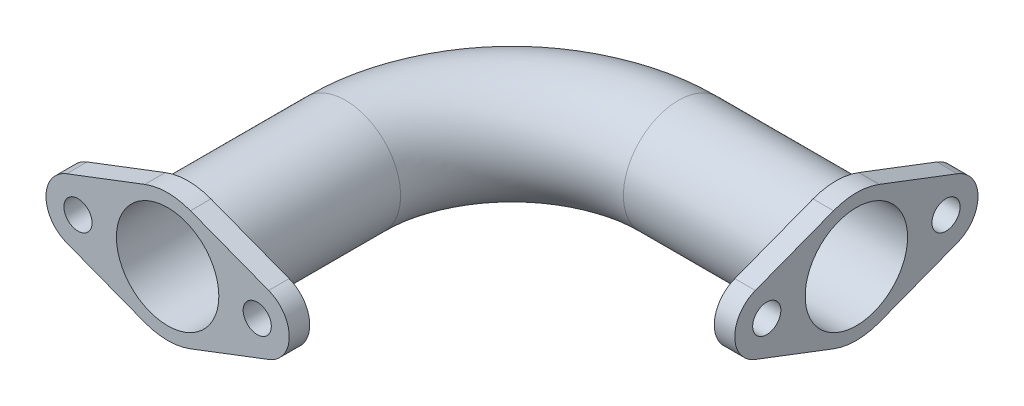
ISO-10303-21;
HEADER;
FILE_DESCRIPTION(('STEP AP214'),'2;1');
FILE_NAME('part.step','',(''),(''),'','','');
FILE_SCHEMA(('AUTOMOTIVE_DESIGN { 1 0 10303 214 1 1 1 1 }'));
ENDSEC;
DATA;
#1=APPLICATION_CONTEXT('core data for automotive mechanical design processes');
#2=APPLICATION_PROTOCOL_DEFINITION('international standard','automotive_design',2000,#1);
#3=PRODUCT_CONTEXT('',#1,'mechanical');
#4=PRODUCT('Part','Part','',(#3));
#5=PRODUCT_RELATED_PRODUCT_CATEGORY('part','',(#4));
#6=PRODUCT_DEFINITION_FORMATION('','',#4);
#7=PRODUCT_DEFINITION_CONTEXT('part definition',#1,'design');
#8=PRODUCT_DEFINITION('design','',#6,#7);
#9=PRODUCT_DEFINITION_SHAPE('','',#8);
#10=(LENGTH_UNIT() NAMED_UNIT(*) SI_UNIT(.MILLI.,.METRE.));
#11=(NAMED_UNIT(*) PLANE_ANGLE_UNIT() SI_UNIT($,.RADIAN.));
#12=(NAMED_UNIT(*) SI_UNIT($,.STERADIAN.) SOLID_ANGLE_UNIT());
#13=UNCERTAINTY_MEASURE_WITH_UNIT(LENGTH_MEASURE(1.E-05),#10,'distance_accuracy_value','');
#14=(GEOMETRIC_REPRESENTATION_CONTEXT(3) GLOBAL_UNCERTAINTY_ASSIGNED_CONTEXT((#13)) GLOBAL_UNIT_ASSIGNED_CONTEXT((#10,
#11,#12)) REPRESENTATION_CONTEXT('',''));
#15=CARTESIAN_POINT('',(0.,0.,0.));
#16=DIRECTION('',(0.,0.,1.));
#17=DIRECTION('',(1.,0.,0.));
#18=AXIS2_PLACEMENT_3D('',#15,#16,#17);
#19=CARTESIAN_POINT('',(-21.5,0.,0.));
#20=DIRECTION('',(0.,0.,-1.));
#21=DIRECTION('',(-1.,0.,0.));
#22=AXIS2_PLACEMENT_3D('',#19,#20,#21);
#23=CYLINDRICAL_SURFACE('',#22,21.5);
#24=CARTESIAN_POINT('',(-21.5,0.,-61.5));
#25=DIRECTION('',(0.,0.,-1.));
#26=DIRECTION('',(-1.,0.,0.));
#27=AXIS2_PLACEMENT_3D('',#24,#25,#26);
#28=CIRCLE('',#27,21.5);
#29=CARTESIAN_POINT('',(-43.,0.,-61.5));
#30=VERTEX_POINT('',#29);
#31=EDGE_CURVE('E212',#30,#30,#28,.T.);
#32=ORIENTED_EDGE('',*,*,#31,.F.);
#33=EDGE_LOOP('',(#32));
#34=FACE_BOUND('',#33,.T.);
#35=CARTESIAN_POINT('',(-21.5,0.,0.));
#36=DIRECTION('',(0.,0.,-1.));
#37=DIRECTION('',(-1.,0.,0.));
#38=AXIS2_PLACEMENT_3D('',#35,#36,#37);
#39=CIRCLE('',#38,21.5);
#40=CARTESIAN_POINT('',(-43.,0.,0.));
#41=VERTEX_POINT('',#40);
#42=EDGE_CURVE('E172',#41,#41,#39,.T.);
#43=ORIENTED_EDGE('',*,*,#42,.T.);
#44=EDGE_LOOP('',(#43));
#45=FACE_BOUND('',#44,.T.);
#46=ADVANCED_FACE('F61',(#34,#45),#23,.T.);
#47=CARTESIAN_POINT('',(43.5,0.,-61.5));
#48=DIRECTION('',(0.,-1.,0.));
#49=DIRECTION('',(0.,0.,-1.));
#50=AXIS2_PLACEMENT_3D('',#47,#48,#49);
#51=TOROIDAL_SURFACE('',#50,65.,21.5);
#52=CARTESIAN_POINT('',(43.5,0.,-126.5));
#53=DIRECTION('',(1.,0.,0.));
#54=DIRECTION('',(0.,0.,-1.));
#55=AXIS2_PLACEMENT_3D('',#52,#53,#54);
#56=CIRCLE('',#55,21.5);
#57=CARTESIAN_POINT('',(43.5,0.,-148.));
#58=VERTEX_POINT('',#57);
#59=EDGE_CURVE('E70',#58,#58,#56,.T.);
#60=CARTESIAN_POINT('',(43.5,0.,-61.5));
#61=DIRECTION('',(0.,-1.,0.));
#62=DIRECTION('',(0.,0.,-1.));
#63=AXIS2_PLACEMENT_3D('',#60,#61,#62);
#64=CIRCLE('',#63,86.5);
#65=EDGE_CURVE('',#30,#58,#64,.T.);
#66=ORIENTED_EDGE('',*,*,#31,.T.);
#67=ORIENTED_EDGE('',*,*,#59,.F.);
#68=ORIENTED_EDGE('',*,*,#65,.T.);
#69=ORIENTED_EDGE('',*,*,#65,.F.);
#70=EDGE_LOOP('',(#66,#68,#67,#69));
#71=FACE_BOUND('',#70,.T.);
#72=ADVANCED_FACE('F221',(#71),#51,.T.);
#73=CARTESIAN_POINT('',(43.5,0.,-126.5));
#74=DIRECTION('',(1.,0.,0.));
#75=DIRECTION('',(0.,0.,-1.));
#76=AXIS2_PLACEMENT_3D('',#73,#74,#75);
#77=CYLINDRICAL_SURFACE('',#76,21.5);
#78=CARTESIAN_POINT('',(105.,0.,-126.5));
#79=DIRECTION('',(1.,0.,0.));
#80=DIRECTION('',(0.,0.,-1.));
#81=AXIS2_PLACEMENT_3D('',#78,#79,#80);
#82=CIRCLE('',#81,21.5);
#83=CARTESIAN_POINT('',(105.,0.,-148.));
#84=VERTEX_POINT('',#83);
#85=EDGE_CURVE('E12',#84,#84,#82,.T.);
#86=ORIENTED_EDGE('',*,*,#85,.F.);
#87=EDGE_LOOP('',(#86));
#88=FACE_BOUND('',#87,.T.);
#89=ORIENTED_EDGE('',*,*,#59,.T.);
#90=EDGE_LOOP('',(#89));
#91=FACE_BOUND('',#90,.T.);
#92=ADVANCED_FACE('F63',(#88,#91),#77,.T.);
#93=CARTESIAN_POINT('',(43.5,0.,-126.5));
#94=DIRECTION('',(1.,0.,0.));
#95=DIRECTION('',(0.,0.,-1.));
#96=AXIS2_PLACEMENT_3D('',#93,#94,#95);
#97=CYLINDRICAL_SURFACE('',#96,20.);
#98=CARTESIAN_POINT('',(43.5,0.,-126.5));
#99=DIRECTION('',(1.,0.,0.));
#100=DIRECTION('',(0.,0.,-1.));
#101=AXIS2_PLACEMENT_3D('',#98,#99,#100);
#102=CIRCLE('',#101,20.);
#103=CARTESIAN_POINT('',(43.5,0.,-146.5));
#104=VERTEX_POINT('',#103);
#105=EDGE_CURVE('E206',#104,#104,#102,.T.);
#106=ORIENTED_EDGE('',*,*,#105,.F.);
#107=EDGE_LOOP('',(#106));
#108=FACE_BOUND('',#107,.T.);
#109=CARTESIAN_POINT('',(113.,0.,-126.5));
#110=DIRECTION('',(1.,0.,0.));
#111=DIRECTION('',(0.,0.,-1.));
#112=AXIS2_PLACEMENT_3D('',#109,#110,#111);
#113=CIRCLE('',#112,20.);
#114=CARTESIAN_POINT('',(113.,0.,-146.5));
#115=VERTEX_POINT('',#114);
#116=EDGE_CURVE('E162',#115,#115,#113,.F.);
#117=ORIENTED_EDGE('',*,*,#116,.F.);
#118=EDGE_LOOP('',(#117));
#119=FACE_BOUND('',#118,.T.);
#120=ADVANCED_FACE('F229',(#108,#119),#97,.F.);
#121=CARTESIAN_POINT('',(-21.5,0.,4.));
#122=DIRECTION('',(0.,0.,-1.));
#123=DIRECTION('',(-1.,0.,0.));
#124=AXIS2_PLACEMENT_3D('',#121,#122,#123);
#125=CYLINDRICAL_SURFACE('',#124,20.);
#126=CARTESIAN_POINT('',(-21.5,0.,-61.5));
#127=DIRECTION('',(0.,0.,-1.));
#128=DIRECTION('',(-1.,0.,0.));
#129=AXIS2_PLACEMENT_3D('',#126,#127,#128);
#130=CIRCLE('',#129,20.);
#131=CARTESIAN_POINT('',(-41.5,0.,-61.5));
#132=VERTEX_POINT('',#131);
#133=EDGE_CURVE('E209',#132,#132,#130,.T.);
#134=ORIENTED_EDGE('',*,*,#133,.T.);
#135=EDGE_LOOP('',(#134));
#136=FACE_BOUND('',#135,.T.);
#137=CARTESIAN_POINT('',(-21.5,0.,8.));
#138=DIRECTION('',(0.,0.,1.));
#139=DIRECTION('',(1.,0.,0.));
#140=AXIS2_PLACEMENT_3D('',#137,#138,#139);
#141=CIRCLE('',#140,20.);
#142=CARTESIAN_POINT('',(-1.5,0.,8.));
#143=VERTEX_POINT('',#142);
#144=EDGE_CURVE('E285',#143,#143,#141,.F.);
#145=ORIENTED_EDGE('',*,*,#144,.F.);
#146=EDGE_LOOP('',(#145));
#147=FACE_BOUND('',#146,.T.);
#148=ADVANCED_FACE('F344',(#136,#147),#125,.F.);
#149=CARTESIAN_POINT('',(43.5,0.,-61.5));
#150=DIRECTION('',(0.,-1.,0.));
#151=DIRECTION('',(0.,0.,-1.));
#152=AXIS2_PLACEMENT_3D('',#149,#150,#151);
#153=TOROIDAL_SURFACE('',#152,65.,20.);
#154=CARTESIAN_POINT('',(43.5,0.,-61.5));
#155=DIRECTION('',(0.,-1.,0.));
#156=DIRECTION('',(0.,0.,-1.));
#157=AXIS2_PLACEMENT_3D('',#154,#155,#156);
#158=CIRCLE('',#157,85.);
#159=EDGE_CURVE('',#132,#104,#158,.T.);
#160=ORIENTED_EDGE('',*,*,#133,.F.);
#161=ORIENTED_EDGE('',*,*,#105,.T.);
#162=ORIENTED_EDGE('',*,*,#159,.T.);
#163=ORIENTED_EDGE('',*,*,#159,.F.);
#164=EDGE_LOOP('',(#160,#162,#161,#163));
#165=FACE_BOUND('',#164,.T.);
#166=ADVANCED_FACE('F347',(#165),#153,.F.);
#167=CARTESIAN_POINT('',(113.,65.5502787555411,-25.0637755102034));
#168=DIRECTION('',(0.,-0.934049773615861,0.357142857142851));
#169=DIRECTION('',(0.,-0.357142857142851,-0.934049773615861));
#170=AXIS2_PLACEMENT_3D('',#167,#168,#169);
#171=PLANE('',#170);
#172=DIRECTION('',(0.,0.357142857142851,0.934049773615861));
#173=VECTOR('',#172,1.);
#174=CARTESIAN_POINT('',(105.,65.5502787555411,-25.0637755102034));
#175=LINE('',#174,#173);
#176=CARTESIAN_POINT('',(105.,11.6756221701985,-165.964285714286));
#177=VERTEX_POINT('',#176);
#178=CARTESIAN_POINT('',(105.,23.3512443403966,-135.428571428572));
#179=VERTEX_POINT('',#178);
#180=EDGE_CURVE('E175',#177,#179,#175,.T.);
#181=ORIENTED_EDGE('',*,*,#180,.T.);
#182=DIRECTION('',(-1.,0.,0.));
#183=VECTOR('',#182,1.);
#184=CARTESIAN_POINT('',(113.,23.3512443403966,-135.428571428572));
#185=LINE('',#184,#183);
#186=CARTESIAN_POINT('',(113.,23.3512443403966,-135.428571428572));
#187=VERTEX_POINT('',#186);
#188=EDGE_CURVE('E204',#187,#179,#185,.T.);
#189=ORIENTED_EDGE('',*,*,#188,.F.);
#190=DIRECTION('',(0.,0.357142857142851,0.934049773615861));
#191=VECTOR('',#190,1.);
#192=CARTESIAN_POINT('',(113.,65.5502787555411,-25.0637755102034));
#193=LINE('',#192,#191);
#194=CARTESIAN_POINT('',(113.,11.6756221701985,-165.964285714286));
#195=VERTEX_POINT('',#194);
#196=EDGE_CURVE('E308',#195,#187,#193,.T.);
#197=ORIENTED_EDGE('',*,*,#196,.F.);
#198=DIRECTION('',(-1.,0.,0.));
#199=VECTOR('',#198,1.);
#200=CARTESIAN_POINT('',(113.,11.6756221701985,-165.964285714286));
#201=LINE('',#200,#199);
#202=EDGE_CURVE('E78',#195,#177,#201,.T.);
#203=ORIENTED_EDGE('',*,*,#202,.T.);
#204=EDGE_LOOP('',(#181,#189,#197,#203));
#205=FACE_BOUND('',#204,.T.);
#206=ADVANCED_FACE('F371',(#205),#171,.F.);
#207=CARTESIAN_POINT('',(113.,0.,-126.5));
#208=DIRECTION('',(-1.,0.,0.));
#209=DIRECTION('',(0.,0.,1.));
#210=AXIS2_PLACEMENT_3D('',#207,#208,#209);
#211=CYLINDRICAL_SURFACE('',#210,25.0000000000001);
#212=CARTESIAN_POINT('',(105.,0.,-126.5));
#213=DIRECTION('',(1.,0.,0.));
#214=DIRECTION('',(0.,0.,-1.));
#215=AXIS2_PLACEMENT_3D('',#212,#213,#214);
#216=CIRCLE('',#215,25.0000000000001);
#217=CARTESIAN_POINT('',(105.,23.3512443403965,-117.571428571429));
#218=VERTEX_POINT('',#217);
#219=EDGE_CURVE('E177',#179,#218,#216,.T.);
#220=ORIENTED_EDGE('',*,*,#219,.T.);
#221=DIRECTION('',(-1.,0.,0.));
#222=VECTOR('',#221,1.);
#223=CARTESIAN_POINT('',(113.,23.3512443403965,-117.571428571429));
#224=LINE('',#223,#222);
#225=CARTESIAN_POINT('',(113.,23.3512443403965,-117.571428571429));
#226=VERTEX_POINT('',#225);
#227=EDGE_CURVE('E202',#226,#218,#224,.T.);
#228=ORIENTED_EDGE('',*,*,#227,.F.);
#229=CARTESIAN_POINT('',(113.,0.,-126.5));
#230=DIRECTION('',(1.,0.,0.));
#231=DIRECTION('',(0.,0.,-1.));
#232=AXIS2_PLACEMENT_3D('',#229,#230,#231);
#233=CIRCLE('',#232,25.0000000000001);
#234=EDGE_CURVE('E118',#187,#226,#233,.T.);
#235=ORIENTED_EDGE('',*,*,#234,.F.);
#236=ORIENTED_EDGE('',*,*,#188,.T.);
#237=EDGE_LOOP('',(#220,#228,#235,#236));
#238=FACE_BOUND('',#237,.T.);
#239=ADVANCED_FACE('F379',(#238),#211,.T.);
#240=CARTESIAN_POINT('',(113.,-18.8477900747486,-7.20663265306122));
#241=DIRECTION('',(0.,0.934049773615859,0.357142857142857));
#242=DIRECTION('',(0.,-0.357142857142857,0.934049773615859));
#243=AXIS2_PLACEMENT_3D('',#240,#241,#242);
#244=PLANE('',#243);
#245=DIRECTION('',(0.,0.357142857142857,-0.934049773615859));
#246=VECTOR('',#245,1.);
#247=CARTESIAN_POINT('',(105.,-18.8477900747486,-7.20663265306122));
#248=LINE('',#247,#246);
#249=CARTESIAN_POINT('',(105.,11.6756221701982,-87.0357142857143));
#250=VERTEX_POINT('',#249);
#251=EDGE_CURVE('E180',#250,#218,#248,.T.);
#252=ORIENTED_EDGE('',*,*,#251,.F.);
#253=DIRECTION('',(-1.,0.,0.));
#254=VECTOR('',#253,1.);
#255=CARTESIAN_POINT('',(113.,11.6756221701982,-87.0357142857143));
#256=LINE('',#255,#254);
#257=CARTESIAN_POINT('',(113.,11.6756221701982,-87.0357142857143));
#258=VERTEX_POINT('',#257);
#259=EDGE_CURVE('E200',#258,#250,#256,.T.);
#260=ORIENTED_EDGE('',*,*,#259,.F.);
#261=DIRECTION('',(0.,0.357142857142857,-0.934049773615859));
#262=VECTOR('',#261,1.);
#263=CARTESIAN_POINT('',(113.,-18.8477900747486,-7.20663265306122));
#264=LINE('',#263,#262);
#265=EDGE_CURVE('E311',#258,#226,#264,.T.);
#266=ORIENTED_EDGE('',*,*,#265,.T.);
#267=ORIENTED_EDGE('',*,*,#227,.T.);
#268=EDGE_LOOP('',(#252,#260,#266,#267));
#269=FACE_BOUND('',#268,.T.);
#270=ADVANCED_FACE('F383',(#269),#244,.T.);
#271=CARTESIAN_POINT('',(113.,0.,-91.5));
#272=DIRECTION('',(-1.,0.,0.));
#273=DIRECTION('',(0.,0.,1.));
#274=AXIS2_PLACEMENT_3D('',#271,#272,#273);
#275=CYLINDRICAL_SURFACE('',#274,12.5);
#276=CARTESIAN_POINT('',(105.,0.,-91.5));
#277=DIRECTION('',(1.,0.,0.));
#278=DIRECTION('',(0.,0.,-1.));
#279=AXIS2_PLACEMENT_3D('',#276,#277,#278);
#280=CIRCLE('',#279,12.5);
#281=CARTESIAN_POINT('',(105.,-11.6756221701982,-87.0357142857143));
#282=VERTEX_POINT('',#281);
#283=EDGE_CURVE('E183',#250,#282,#280,.T.);
#284=ORIENTED_EDGE('',*,*,#283,.T.);
#285=DIRECTION('',(-1.,0.,0.));
#286=VECTOR('',#285,1.);
#287=CARTESIAN_POINT('',(113.,-11.6756221701982,-87.0357142857143));
#288=LINE('',#287,#286);
#289=CARTESIAN_POINT('',(113.,-11.6756221701982,-87.0357142857143));
#290=VERTEX_POINT('',#289);
#291=EDGE_CURVE('E197',#290,#282,#288,.T.);
#292=ORIENTED_EDGE('',*,*,#291,.F.);
#293=CARTESIAN_POINT('',(113.,0.,-91.5));
#294=DIRECTION('',(1.,0.,0.));
#295=DIRECTION('',(0.,0.,-1.));
#296=AXIS2_PLACEMENT_3D('',#293,#294,#295);
#297=CIRCLE('',#296,12.5);
#298=EDGE_CURVE('E314',#258,#290,#297,.T.);
#299=ORIENTED_EDGE('',*,*,#298,.F.);
#300=ORIENTED_EDGE('',*,*,#259,.T.);
#301=EDGE_LOOP('',(#284,#292,#299,#300));
#302=FACE_BOUND('',#301,.T.);
#303=ADVANCED_FACE('F319',(#302),#275,.T.);
#304=CARTESIAN_POINT('',(113.,18.8477900747486,-7.20663265306123));
#305=DIRECTION('',(0.,0.934049773615859,-0.357142857142857));
#306=DIRECTION('',(0.,0.357142857142857,0.934049773615859));
#307=AXIS2_PLACEMENT_3D('',#304,#305,#306);
#308=PLANE('',#307);
#309=DIRECTION('',(0.,-0.357142857142857,-0.934049773615859));
#310=VECTOR('',#309,1.);
#311=CARTESIAN_POINT('',(105.,18.8477900747486,-7.20663265306123));
#312=LINE('',#311,#310);
#313=CARTESIAN_POINT('',(105.,-23.3512443403965,-117.571428571429));
#314=VERTEX_POINT('',#313);
#315=EDGE_CURVE('E185',#282,#314,#312,.T.);
#316=ORIENTED_EDGE('',*,*,#315,.T.);
#317=DIRECTION('',(-1.,0.,0.));
#318=VECTOR('',#317,1.);
#319=CARTESIAN_POINT('',(113.,-23.3512443403965,-117.571428571429));
#320=LINE('',#319,#318);
#321=CARTESIAN_POINT('',(113.,-23.3512443403965,-117.571428571429));
#322=VERTEX_POINT('',#321);
#323=EDGE_CURVE('E157',#322,#314,#320,.T.);
#324=ORIENTED_EDGE('',*,*,#323,.F.);
#325=DIRECTION('',(0.,-0.357142857142857,-0.934049773615859));
#326=VECTOR('',#325,1.);
#327=CARTESIAN_POINT('',(113.,18.8477900747486,-7.20663265306123));
#328=LINE('',#327,#326);
#329=EDGE_CURVE('E145',#290,#322,#328,.T.);
#330=ORIENTED_EDGE('',*,*,#329,.F.);
#331=ORIENTED_EDGE('',*,*,#291,.T.);
#332=EDGE_LOOP('',(#316,#324,#330,#331));
#333=FACE_BOUND('',#332,.T.);
#334=ADVANCED_FACE('F323',(#333),#308,.F.);
#335=CARTESIAN_POINT('',(113.,0.,-126.5));
#336=DIRECTION('',(-1.,0.,0.));
#337=DIRECTION('',(0.,0.,1.));
#338=AXIS2_PLACEMENT_3D('',#335,#336,#337);
#339=CYLINDRICAL_SURFACE('',#338,25.0000000000001);
#340=CARTESIAN_POINT('',(105.,0.,-126.5));
#341=DIRECTION('',(1.,0.,0.));
#342=DIRECTION('',(0.,0.,-1.));
#343=AXIS2_PLACEMENT_3D('',#340,#341,#342);
#344=CIRCLE('',#343,25.0000000000001);
#345=CARTESIAN_POINT('',(105.,-23.3512443403964,-135.428571428572));
#346=VERTEX_POINT('',#345);
#347=EDGE_CURVE('E154',#314,#346,#344,.T.);
#348=ORIENTED_EDGE('',*,*,#347,.T.);
#349=DIRECTION('',(-1.,0.,0.));
#350=VECTOR('',#349,1.);
#351=CARTESIAN_POINT('',(113.,-23.3512443403964,-135.428571428572));
#352=LINE('',#351,#350);
#353=CARTESIAN_POINT('',(113.,-23.3512443403964,-135.428571428572));
#354=VERTEX_POINT('',#353);
#355=EDGE_CURVE('E151',#354,#346,#352,.T.);
#356=ORIENTED_EDGE('',*,*,#355,.F.);
#357=CARTESIAN_POINT('',(113.,0.,-126.5));
#358=DIRECTION('',(1.,0.,0.));
#359=DIRECTION('',(0.,0.,-1.));
#360=AXIS2_PLACEMENT_3D('',#357,#358,#359);
#361=CIRCLE('',#360,25.0000000000001);
#362=EDGE_CURVE('E137',#322,#354,#361,.T.);
#363=ORIENTED_EDGE('',*,*,#362,.F.);
#364=ORIENTED_EDGE('',*,*,#323,.T.);
#365=EDGE_LOOP('',(#348,#356,#363,#364));
#366=FACE_BOUND('',#365,.T.);
#367=ADVANCED_FACE('F152',(#366),#339,.T.);
#368=CARTESIAN_POINT('',(113.,-65.5502787555422,-25.0637755102049));
#369=DIRECTION('',(0.,-0.934049773615856,-0.357142857142863));
#370=DIRECTION('',(0.,0.357142857142863,-0.934049773615856));
#371=AXIS2_PLACEMENT_3D('',#368,#369,#370);
#372=PLANE('',#371);
#373=DIRECTION('',(0.,-0.357142857142863,0.934049773615856));
#374=VECTOR('',#373,1.);
#375=CARTESIAN_POINT('',(105.,-65.5502787555422,-25.0637755102049));
#376=LINE('',#375,#374);
#377=CARTESIAN_POINT('',(105.,-11.6756221701979,-165.964285714286));
#378=VERTEX_POINT('',#377);
#379=EDGE_CURVE('E188',#378,#346,#376,.T.);
#380=ORIENTED_EDGE('',*,*,#379,.F.);
#381=DIRECTION('',(-1.,0.,0.));
#382=VECTOR('',#381,1.);
#383=CARTESIAN_POINT('',(113.,-11.6756221701979,-165.964285714286));
#384=LINE('',#383,#382);
#385=CARTESIAN_POINT('',(113.,-11.6756221701979,-165.964285714286));
#386=VERTEX_POINT('',#385);
#387=EDGE_CURVE('E105',#386,#378,#384,.T.);
#388=ORIENTED_EDGE('',*,*,#387,.F.);
#389=DIRECTION('',(0.,-0.357142857142863,0.934049773615856));
#390=VECTOR('',#389,1.);
#391=CARTESIAN_POINT('',(113.,-65.5502787555422,-25.0637755102049));
#392=LINE('',#391,#390);
#393=EDGE_CURVE('E143',#386,#354,#392,.T.);
#394=ORIENTED_EDGE('',*,*,#393,.T.);
#395=ORIENTED_EDGE('',*,*,#355,.T.);
#396=EDGE_LOOP('',(#380,#388,#394,#395));
#397=FACE_BOUND('',#396,.T.);
#398=ADVANCED_FACE('F159',(#397),#372,.T.);
#399=CARTESIAN_POINT('',(113.,2.63677968348475E-13,-161.5));
#400=DIRECTION('',(-1.,0.,0.));
#401=DIRECTION('',(0.,0.,1.));
#402=AXIS2_PLACEMENT_3D('',#399,#400,#401);
#403=CYLINDRICAL_SURFACE('',#402,12.5);
#404=CARTESIAN_POINT('',(105.,2.63677968348475E-13,-161.5));
#405=DIRECTION('',(1.,0.,0.));
#406=DIRECTION('',(0.,0.,-1.));
#407=AXIS2_PLACEMENT_3D('',#404,#405,#406);
#408=CIRCLE('',#407,12.5);
#409=EDGE_CURVE('E190',#177,#378,#408,.F.);
#410=ORIENTED_EDGE('',*,*,#409,.F.);
#411=ORIENTED_EDGE('',*,*,#202,.F.);
#412=CARTESIAN_POINT('',(113.,2.63677968348475E-13,-161.5));
#413=DIRECTION('',(1.,0.,0.));
#414=DIRECTION('',(0.,0.,-1.));
#415=AXIS2_PLACEMENT_3D('',#412,#413,#414);
#416=CIRCLE('',#415,12.5);
#417=EDGE_CURVE('E160',#195,#386,#416,.F.);
#418=ORIENTED_EDGE('',*,*,#417,.T.);
#419=ORIENTED_EDGE('',*,*,#387,.T.);
#420=EDGE_LOOP('',(#410,#411,#418,#419));
#421=FACE_BOUND('',#420,.T.);
#422=ADVANCED_FACE('F326',(#421),#403,.T.);
#423=CARTESIAN_POINT('',(113.,0.,-91.5));
#424=DIRECTION('',(-1.,0.,0.));
#425=DIRECTION('',(0.,0.,1.));
#426=AXIS2_PLACEMENT_3D('',#423,#424,#425);
#427=CYLINDRICAL_SURFACE('',#426,5.5);
#428=CARTESIAN_POINT('',(113.,0.,-91.5));
#429=DIRECTION('',(1.,0.,0.));
#430=DIRECTION('',(0.,0.,-1.));
#431=AXIS2_PLACEMENT_3D('',#428,#429,#430);
#432=CIRCLE('',#431,5.5);
#433=CARTESIAN_POINT('',(113.,0.,-97.));
#434=VERTEX_POINT('',#433);
#435=EDGE_CURVE('E305',#434,#434,#432,.T.);
#436=ORIENTED_EDGE('',*,*,#435,.T.);
#437=EDGE_LOOP('',(#436));
#438=FACE_BOUND('',#437,.T.);
#439=CARTESIAN_POINT('',(105.,0.,-91.5));
#440=DIRECTION('',(1.,0.,0.));
#441=DIRECTION('',(0.,0.,-1.));
#442=AXIS2_PLACEMENT_3D('',#439,#440,#441);
#443=CIRCLE('',#442,5.5);
#444=CARTESIAN_POINT('',(105.,0.,-97.));
#445=VERTEX_POINT('',#444);
#446=EDGE_CURVE('E171',#445,#445,#443,.T.);
#447=ORIENTED_EDGE('',*,*,#446,.F.);
#448=EDGE_LOOP('',(#447));
#449=FACE_BOUND('',#448,.T.);
#450=ADVANCED_FACE('F328',(#438,#449),#427,.F.);
#451=CARTESIAN_POINT('',(113.,2.63677968348475E-13,-161.5));
#452=DIRECTION('',(-1.,0.,0.));
#453=DIRECTION('',(0.,0.,1.));
#454=AXIS2_PLACEMENT_3D('',#451,#452,#453);
#455=CYLINDRICAL_SURFACE('',#454,5.50000000000001);
#456=CARTESIAN_POINT('',(113.,2.63677968348475E-13,-161.5));
#457=DIRECTION('',(1.,0.,0.));
#458=DIRECTION('',(0.,0.,-1.));
#459=AXIS2_PLACEMENT_3D('',#456,#457,#458);
#460=CIRCLE('',#459,5.50000000000001);
#461=CARTESIAN_POINT('',(113.,2.63677968348475E-13,-167.));
#462=VERTEX_POINT('',#461);
#463=EDGE_CURVE('E193',#462,#462,#460,.F.);
#464=ORIENTED_EDGE('',*,*,#463,.F.);
#465=EDGE_LOOP('',(#464));
#466=FACE_BOUND('',#465,.T.);
#467=CARTESIAN_POINT('',(105.,2.63677968348475E-13,-161.5));
#468=DIRECTION('',(1.,0.,0.));
#469=DIRECTION('',(0.,0.,-1.));
#470=AXIS2_PLACEMENT_3D('',#467,#468,#469);
#471=CIRCLE('',#470,5.50000000000001);
#472=CARTESIAN_POINT('',(105.,2.63677968348475E-13,-167.));
#473=VERTEX_POINT('',#472);
#474=EDGE_CURVE('E168',#473,#473,#471,.F.);
#475=ORIENTED_EDGE('',*,*,#474,.T.);
#476=EDGE_LOOP('',(#475));
#477=FACE_BOUND('',#476,.T.);
#478=ADVANCED_FACE('F334',(#466,#477),#455,.F.);
#479=CARTESIAN_POINT('',(113.,0.,0.));
#480=DIRECTION('',(1.,0.,0.));
#481=DIRECTION('',(0.,0.,-1.));
#482=AXIS2_PLACEMENT_3D('',#479,#480,#481);
#483=PLANE('',#482);
#484=ORIENTED_EDGE('',*,*,#463,.T.);
#485=EDGE_LOOP('',(#484));
#486=FACE_BOUND('',#485,.T.);
#487=ORIENTED_EDGE('',*,*,#435,.F.);
#488=EDGE_LOOP('',(#487));
#489=FACE_BOUND('',#488,.T.);
#490=ORIENTED_EDGE('',*,*,#196,.T.);
#491=ORIENTED_EDGE('',*,*,#234,.T.);
#492=ORIENTED_EDGE('',*,*,#265,.F.);
#493=ORIENTED_EDGE('',*,*,#298,.T.);
#494=ORIENTED_EDGE('',*,*,#329,.T.);
#495=ORIENTED_EDGE('',*,*,#362,.T.);
#496=ORIENTED_EDGE('',*,*,#393,.F.);
#497=ORIENTED_EDGE('',*,*,#417,.F.);
#498=EDGE_LOOP('',(#490,#491,#492,#493,#494,#495,#496,#497));
#499=FACE_BOUND('',#498,.T.);
#500=ORIENTED_EDGE('',*,*,#116,.T.);
#501=EDGE_LOOP('',(#500));
#502=FACE_BOUND('',#501,.T.);
#503=ADVANCED_FACE('F139',(#486,#489,#499,#502),#483,.T.);
#504=CARTESIAN_POINT('',(105.,0.,0.));
#505=DIRECTION('',(1.,0.,0.));
#506=DIRECTION('',(0.,0.,-1.));
#507=AXIS2_PLACEMENT_3D('',#504,#505,#506);
#508=PLANE('',#507);
#509=ORIENTED_EDGE('',*,*,#85,.T.);
#510=EDGE_LOOP('',(#509));
#511=FACE_BOUND('',#510,.T.);
#512=ORIENTED_EDGE('',*,*,#474,.F.);
#513=EDGE_LOOP('',(#512));
#514=FACE_BOUND('',#513,.T.);
#515=ORIENTED_EDGE('',*,*,#446,.T.);
#516=EDGE_LOOP('',(#515));
#517=FACE_BOUND('',#516,.T.);
#518=ORIENTED_EDGE('',*,*,#180,.F.);
#519=ORIENTED_EDGE('',*,*,#409,.T.);
#520=ORIENTED_EDGE('',*,*,#379,.T.);
#521=ORIENTED_EDGE('',*,*,#347,.F.);
#522=ORIENTED_EDGE('',*,*,#315,.F.);
#523=ORIENTED_EDGE('',*,*,#283,.F.);
#524=ORIENTED_EDGE('',*,*,#251,.T.);
#525=ORIENTED_EDGE('',*,*,#219,.F.);
#526=EDGE_LOOP('',(#518,#519,#520,#521,#522,#523,#524,#525));
#527=FACE_BOUND('',#526,.T.);
#528=ADVANCED_FACE('F325',(#511,#514,#517,#527),#508,.F.);
#529=CARTESIAN_POINT('',(6.18622448979586,16.1790764358463,8.));
#530=DIRECTION('',(-0.357142857142851,-0.934049773615861,0.));
#531=DIRECTION('',(0.934049773615861,-0.357142857142851,0.));
#532=AXIS2_PLACEMENT_3D('',#529,#530,#531);
#533=PLANE('',#532);
#534=DIRECTION('',(-0.934049773615861,0.357142857142851,0.));
#535=VECTOR('',#534,1.);
#536=CARTESIAN_POINT('',(6.18622448979586,16.1790764358463,0.));
#537=LINE('',#536,#535);
#538=CARTESIAN_POINT('',(17.9642857142859,11.6756221701984,0.));
#539=VERTEX_POINT('',#538);
#540=CARTESIAN_POINT('',(-12.5714285714285,23.3512443403965,0.));
#541=VERTEX_POINT('',#540);
#542=EDGE_CURVE('E249',#539,#541,#537,.T.);
#543=ORIENTED_EDGE('',*,*,#542,.T.);
#544=DIRECTION('',(0.,0.,-1.));
#545=VECTOR('',#544,1.);
#546=CARTESIAN_POINT('',(-12.5714285714285,23.3512443403965,8.));
#547=LINE('',#546,#545);
#548=CARTESIAN_POINT('',(-12.5714285714285,23.3512443403965,8.));
#549=VERTEX_POINT('',#548);
#550=EDGE_CURVE('E215',#549,#541,#547,.T.);
#551=ORIENTED_EDGE('',*,*,#550,.F.);
#552=DIRECTION('',(-0.934049773615861,0.357142857142851,0.));
#553=VECTOR('',#552,1.);
#554=CARTESIAN_POINT('',(6.18622448979586,16.1790764358463,8.));
#555=LINE('',#554,#553);
#556=CARTESIAN_POINT('',(17.9642857142859,11.6756221701984,8.));
#557=VERTEX_POINT('',#556);
#558=EDGE_CURVE('E696',#557,#549,#555,.T.);
#559=ORIENTED_EDGE('',*,*,#558,.F.);
#560=DIRECTION('',(0.,0.,-1.));
#561=VECTOR('',#560,1.);
#562=CARTESIAN_POINT('',(17.9642857142859,11.6756221701984,8.));
#563=LINE('',#562,#561);
#564=EDGE_CURVE('E269',#557,#539,#563,.T.);
#565=ORIENTED_EDGE('',*,*,#564,.T.);
#566=EDGE_LOOP('',(#543,#551,#559,#565));
#567=FACE_BOUND('',#566,.T.);
#568=ADVANCED_FACE('F352',(#567),#533,.F.);
#569=CARTESIAN_POINT('',(-21.5000000000002,0.,8.));
#570=DIRECTION('',(0.,0.,-1.));
#571=DIRECTION('',(-1.,0.,0.));
#572=AXIS2_PLACEMENT_3D('',#569,#570,#571);
#573=CYLINDRICAL_SURFACE('',#572,25.0000000000001);
#574=CARTESIAN_POINT('',(-21.5000000000002,0.,0.));
#575=DIRECTION('',(0.,0.,1.));
#576=DIRECTION('',(1.,0.,0.));
#577=AXIS2_PLACEMENT_3D('',#574,#575,#576);
#578=CIRCLE('',#577,25.0000000000001);
#579=CARTESIAN_POINT('',(-30.4285714285716,23.3512443403964,0.));
#580=VERTEX_POINT('',#579);
#581=EDGE_CURVE('E257',#541,#580,#578,.T.);
#582=ORIENTED_EDGE('',*,*,#581,.T.);
#583=DIRECTION('',(0.,0.,-1.));
#584=VECTOR('',#583,1.);
#585=CARTESIAN_POINT('',(-30.4285714285716,23.3512443403964,8.));
#586=LINE('',#585,#584);
#587=CARTESIAN_POINT('',(-30.4285714285716,23.3512443403964,8.));
#588=VERTEX_POINT('',#587);
#589=EDGE_CURVE('E299',#588,#580,#586,.T.);
#590=ORIENTED_EDGE('',*,*,#589,.F.);
#591=CARTESIAN_POINT('',(-21.5000000000002,0.,8.));
#592=DIRECTION('',(0.,0.,1.));
#593=DIRECTION('',(1.,0.,0.));
#594=AXIS2_PLACEMENT_3D('',#591,#592,#593);
#595=CIRCLE('',#594,25.0000000000001);
#596=EDGE_CURVE('E754',#549,#588,#595,.T.);
#597=ORIENTED_EDGE('',*,*,#596,.F.);
#598=ORIENTED_EDGE('',*,*,#550,.T.);
#599=EDGE_LOOP('',(#582,#590,#597,#598));
#600=FACE_BOUND('',#599,.T.);
#601=ADVANCED_FACE('F448',(#600),#573,.T.);
#602=CARTESIAN_POINT('',(-11.6709183673469,30.5234122449468,8.));
#603=DIRECTION('',(-0.357142857142857,0.934049773615859,0.));
#604=DIRECTION('',(-0.934049773615859,-0.357142857142857,0.));
#605=AXIS2_PLACEMENT_3D('',#602,#603,#604);
#606=PLANE('',#605);
#607=DIRECTION('',(0.934049773615859,0.357142857142857,0.));
#608=VECTOR('',#607,1.);
#609=CARTESIAN_POINT('',(-11.6709183673469,30.5234122449468,0.));
#610=LINE('',#609,#608);
#611=CARTESIAN_POINT('',(-60.9642857142859,11.6756221701981,0.));
#612=VERTEX_POINT('',#611);
#613=EDGE_CURVE('E708',#612,#580,#610,.T.);
#614=ORIENTED_EDGE('',*,*,#613,.F.);
#615=DIRECTION('',(0.,0.,-1.));
#616=VECTOR('',#615,1.);
#617=CARTESIAN_POINT('',(-60.9642857142859,11.6756221701981,8.));
#618=LINE('',#617,#616);
#619=CARTESIAN_POINT('',(-60.9642857142859,11.6756221701981,8.));
#620=VERTEX_POINT('',#619);
#621=EDGE_CURVE('E296',#620,#612,#618,.T.);
#622=ORIENTED_EDGE('',*,*,#621,.F.);
#623=DIRECTION('',(0.934049773615859,0.357142857142857,0.));
#624=VECTOR('',#623,1.);
#625=CARTESIAN_POINT('',(-11.6709183673469,30.5234122449468,8.));
#626=LINE('',#625,#624);
#627=EDGE_CURVE('E757',#620,#588,#626,.T.);
#628=ORIENTED_EDGE('',*,*,#627,.T.);
#629=ORIENTED_EDGE('',*,*,#589,.T.);
#630=EDGE_LOOP('',(#614,#622,#628,#629));
#631=FACE_BOUND('',#630,.T.);
#632=ADVANCED_FACE('F458',(#631),#606,.T.);
#633=CARTESIAN_POINT('',(-56.5000000000002,0.,8.));
#634=DIRECTION('',(0.,0.,-1.));
#635=DIRECTION('',(-1.,0.,0.));
#636=AXIS2_PLACEMENT_3D('',#633,#634,#635);
#637=CYLINDRICAL_SURFACE('',#636,12.5);
#638=CARTESIAN_POINT('',(-56.5000000000002,0.,0.));
#639=DIRECTION('',(0.,0.,1.));
#640=DIRECTION('',(1.,0.,0.));
#641=AXIS2_PLACEMENT_3D('',#638,#639,#640);
#642=CIRCLE('',#641,12.5);
#643=CARTESIAN_POINT('',(-60.9642857142859,-11.6756221701983,0.));
#644=VERTEX_POINT('',#643);
#645=EDGE_CURVE('E710',#612,#644,#642,.T.);
#646=ORIENTED_EDGE('',*,*,#645,.T.);
#647=DIRECTION('',(0.,0.,-1.));
#648=VECTOR('',#647,1.);
#649=CARTESIAN_POINT('',(-60.9642857142859,-11.6756221701983,8.));
#650=LINE('',#649,#648);
#651=CARTESIAN_POINT('',(-60.9642857142859,-11.6756221701983,8.));
#652=VERTEX_POINT('',#651);
#653=EDGE_CURVE('E293',#652,#644,#650,.T.);
#654=ORIENTED_EDGE('',*,*,#653,.F.);
#655=CARTESIAN_POINT('',(-56.5000000000002,0.,8.));
#656=DIRECTION('',(0.,0.,1.));
#657=DIRECTION('',(1.,0.,0.));
#658=AXIS2_PLACEMENT_3D('',#655,#656,#657);
#659=CIRCLE('',#658,12.5);
#660=EDGE_CURVE('E759',#620,#652,#659,.T.);
#661=ORIENTED_EDGE('',*,*,#660,.F.);
#662=ORIENTED_EDGE('',*,*,#621,.T.);
#663=EDGE_LOOP('',(#646,#654,#661,#662));
#664=FACE_BOUND('',#663,.T.);
#665=ADVANCED_FACE('F469',(#664),#637,.T.);
#666=CARTESIAN_POINT('',(-11.670918367347,-30.523412244947,8.));
#667=DIRECTION('',(0.357142857142857,0.934049773615859,0.));
#668=DIRECTION('',(-0.934049773615859,0.357142857142857,0.));
#669=AXIS2_PLACEMENT_3D('',#666,#667,#668);
#670=PLANE('',#669);
#671=DIRECTION('',(0.934049773615859,-0.357142857142857,0.));
#672=VECTOR('',#671,1.);
#673=CARTESIAN_POINT('',(-11.670918367347,-30.523412244947,0.));
#674=LINE('',#673,#672);
#675=CARTESIAN_POINT('',(-30.4285714285716,-23.3512443403966,0.));
#676=VERTEX_POINT('',#675);
#677=EDGE_CURVE('E713',#644,#676,#674,.T.);
#678=ORIENTED_EDGE('',*,*,#677,.T.);
#679=DIRECTION('',(0.,0.,-1.));
#680=VECTOR('',#679,1.);
#681=CARTESIAN_POINT('',(-30.4285714285716,-23.3512443403966,8.));
#682=LINE('',#681,#680);
#683=CARTESIAN_POINT('',(-30.4285714285716,-23.3512443403966,8.));
#684=VERTEX_POINT('',#683);
#685=EDGE_CURVE('E290',#684,#676,#682,.T.);
#686=ORIENTED_EDGE('',*,*,#685,.F.);
#687=DIRECTION('',(0.934049773615859,-0.357142857142857,0.));
#688=VECTOR('',#687,1.);
#689=CARTESIAN_POINT('',(-11.670918367347,-30.523412244947,8.));
#690=LINE('',#689,#688);
#691=EDGE_CURVE('E765',#652,#684,#690,.T.);
#692=ORIENTED_EDGE('',*,*,#691,.F.);
#693=ORIENTED_EDGE('',*,*,#653,.T.);
#694=EDGE_LOOP('',(#678,#686,#692,#693));
#695=FACE_BOUND('',#694,.T.);
#696=ADVANCED_FACE('F480',(#695),#670,.F.);
#697=CARTESIAN_POINT('',(-21.5000000000002,0.,8.));
#698=DIRECTION('',(0.,0.,-1.));
#699=DIRECTION('',(-1.,0.,0.));
#700=AXIS2_PLACEMENT_3D('',#697,#698,#699);
#701=CYLINDRICAL_SURFACE('',#700,25.0000000000001);
#702=CARTESIAN_POINT('',(-21.5000000000002,0.,0.));
#703=DIRECTION('',(0.,0.,1.));
#704=DIRECTION('',(1.,0.,0.));
#705=AXIS2_PLACEMENT_3D('',#702,#703,#704);
#706=CIRCLE('',#705,25.0000000000001);
#707=CARTESIAN_POINT('',(-12.5714285714282,-23.3512443403964,0.));
#708=VERTEX_POINT('',#707);
#709=EDGE_CURVE('E280',#676,#708,#706,.T.);
#710=ORIENTED_EDGE('',*,*,#709,.T.);
#711=DIRECTION('',(0.,0.,-1.));
#712=VECTOR('',#711,1.);
#713=CARTESIAN_POINT('',(-12.5714285714282,-23.3512443403964,8.));
#714=LINE('',#713,#712);
#715=CARTESIAN_POINT('',(-12.5714285714282,-23.3512443403964,8.));
#716=VERTEX_POINT('',#715);
#717=EDGE_CURVE('E287',#716,#708,#714,.T.);
#718=ORIENTED_EDGE('',*,*,#717,.F.);
#719=CARTESIAN_POINT('',(-21.5000000000002,0.,8.));
#720=DIRECTION('',(0.,0.,1.));
#721=DIRECTION('',(1.,0.,0.));
#722=AXIS2_PLACEMENT_3D('',#719,#720,#721);
#723=CIRCLE('',#722,25.0000000000001);
#724=EDGE_CURVE('E767',#684,#716,#723,.T.);
#725=ORIENTED_EDGE('',*,*,#724,.F.);
#726=ORIENTED_EDGE('',*,*,#685,.T.);
#727=EDGE_LOOP('',(#710,#718,#725,#726));
#728=FACE_BOUND('',#727,.T.);
#729=ADVANCED_FACE('F491',(#728),#701,.T.);
#730=CARTESIAN_POINT('',(6.18622448979602,-16.1790764358461,8.));
#731=DIRECTION('',(0.357142857142864,-0.934049773615856,0.));
#732=DIRECTION('',(0.934049773615856,0.357142857142864,0.));
#733=AXIS2_PLACEMENT_3D('',#730,#731,#732);
#734=PLANE('',#733);
#735=DIRECTION('',(-0.934049773615856,-0.357142857142864,0.));
#736=VECTOR('',#735,1.);
#737=CARTESIAN_POINT('',(6.18622448979602,-16.1790764358461,0.));
#738=LINE('',#737,#736);
#739=CARTESIAN_POINT('',(17.964285714286,-11.675622170198,0.));
#740=VERTEX_POINT('',#739);
#741=EDGE_CURVE('E275',#740,#708,#738,.T.);
#742=ORIENTED_EDGE('',*,*,#741,.F.);
#743=DIRECTION('',(0.,0.,-1.));
#744=VECTOR('',#743,1.);
#745=CARTESIAN_POINT('',(17.964285714286,-11.675622170198,8.));
#746=LINE('',#745,#744);
#747=CARTESIAN_POINT('',(17.964285714286,-11.675622170198,8.));
#748=VERTEX_POINT('',#747);
#749=EDGE_CURVE('E272',#748,#740,#746,.T.);
#750=ORIENTED_EDGE('',*,*,#749,.F.);
#751=DIRECTION('',(-0.934049773615856,-0.357142857142864,0.));
#752=VECTOR('',#751,1.);
#753=CARTESIAN_POINT('',(6.18622448979602,-16.1790764358461,8.));
#754=LINE('',#753,#752);
#755=EDGE_CURVE('E701',#748,#716,#754,.T.);
#756=ORIENTED_EDGE('',*,*,#755,.T.);
#757=ORIENTED_EDGE('',*,*,#717,.T.);
#758=EDGE_LOOP('',(#742,#750,#756,#757));
#759=FACE_BOUND('',#758,.T.);
#760=ADVANCED_FACE('F502',(#759),#734,.T.);
#761=CARTESIAN_POINT('',(13.5000000000002,1.78676518025611E-13,8.));
#762=DIRECTION('',(0.,0.,-1.));
#763=DIRECTION('',(-1.,0.,0.));
#764=AXIS2_PLACEMENT_3D('',#761,#762,#763);
#765=CYLINDRICAL_SURFACE('',#764,12.5);
#766=CARTESIAN_POINT('',(13.5000000000002,1.78676518025611E-13,0.));
#767=DIRECTION('',(0.,0.,1.));
#768=DIRECTION('',(1.,0.,0.));
#769=AXIS2_PLACEMENT_3D('',#766,#767,#768);
#770=CIRCLE('',#769,12.5);
#771=EDGE_CURVE('E253',#539,#740,#770,.F.);
#772=ORIENTED_EDGE('',*,*,#771,.F.);
#773=ORIENTED_EDGE('',*,*,#564,.F.);
#774=CARTESIAN_POINT('',(13.5000000000002,1.78676518025611E-13,8.));
#775=DIRECTION('',(0.,0.,1.));
#776=DIRECTION('',(1.,0.,0.));
#777=AXIS2_PLACEMENT_3D('',#774,#775,#776);
#778=CIRCLE('',#777,12.5);
#779=EDGE_CURVE('E699',#557,#748,#778,.F.);
#780=ORIENTED_EDGE('',*,*,#779,.T.);
#781=ORIENTED_EDGE('',*,*,#749,.T.);
#782=EDGE_LOOP('',(#772,#773,#780,#781));
#783=FACE_BOUND('',#782,.T.);
#784=ADVANCED_FACE('F267',(#783),#765,.T.);
#785=CARTESIAN_POINT('',(-56.5000000000002,0.,8.));
#786=DIRECTION('',(0.,0.,-1.));
#787=DIRECTION('',(-1.,0.,0.));
#788=AXIS2_PLACEMENT_3D('',#785,#786,#787);
#789=CYLINDRICAL_SURFACE('',#788,5.5);
#790=CARTESIAN_POINT('',(-56.5000000000002,0.,8.));
#791=DIRECTION('',(0.,0.,1.));
#792=DIRECTION('',(1.,0.,0.));
#793=AXIS2_PLACEMENT_3D('',#790,#791,#792);
#794=CIRCLE('',#793,5.5);
#795=CARTESIAN_POINT('',(-51.0000000000002,0.,8.));
#796=VERTEX_POINT('',#795);
#797=EDGE_CURVE('E278',#796,#796,#794,.T.);
#798=ORIENTED_EDGE('',*,*,#797,.T.);
#799=EDGE_LOOP('',(#798));
#800=FACE_BOUND('',#799,.T.);
#801=CARTESIAN_POINT('',(-56.5000000000002,0.,0.));
#802=DIRECTION('',(0.,0.,1.));
#803=DIRECTION('',(1.,0.,0.));
#804=AXIS2_PLACEMENT_3D('',#801,#802,#803);
#805=CIRCLE('',#804,5.5);
#806=CARTESIAN_POINT('',(-51.0000000000002,0.,0.));
#807=VERTEX_POINT('',#806);
#808=EDGE_CURVE('E244',#807,#807,#805,.T.);
#809=ORIENTED_EDGE('',*,*,#808,.F.);
#810=EDGE_LOOP('',(#809));
#811=FACE_BOUND('',#810,.T.);
#812=ADVANCED_FACE('F523',(#800,#811),#789,.F.);
#813=CARTESIAN_POINT('',(13.5000000000002,1.78676518025611E-13,8.));
#814=DIRECTION('',(0.,0.,-1.));
#815=DIRECTION('',(-1.,0.,0.));
#816=AXIS2_PLACEMENT_3D('',#813,#814,#815);
#817=CYLINDRICAL_SURFACE('',#816,5.50000000000001);
#818=CARTESIAN_POINT('',(13.5000000000002,1.78676518025611E-13,8.));
#819=DIRECTION('',(0.,0.,1.));
#820=DIRECTION('',(1.,0.,0.));
#821=AXIS2_PLACEMENT_3D('',#818,#819,#820);
#822=CIRCLE('',#821,5.50000000000001);
#823=CARTESIAN_POINT('',(19.0000000000002,1.78676518025611E-13,8.));
#824=VERTEX_POINT('',#823);
#825=EDGE_CURVE('E274',#824,#824,#822,.F.);
#826=ORIENTED_EDGE('',*,*,#825,.F.);
#827=EDGE_LOOP('',(#826));
#828=FACE_BOUND('',#827,.T.);
#829=CARTESIAN_POINT('',(13.5000000000002,1.78676518025611E-13,0.));
#830=DIRECTION('',(0.,0.,1.));
#831=DIRECTION('',(1.,0.,0.));
#832=AXIS2_PLACEMENT_3D('',#829,#830,#831);
#833=CIRCLE('',#832,5.50000000000001);
#834=CARTESIAN_POINT('',(19.0000000000002,1.78676518025611E-13,0.));
#835=VERTEX_POINT('',#834);
#836=EDGE_CURVE('E240',#835,#835,#833,.F.);
#837=ORIENTED_EDGE('',*,*,#836,.T.);
#838=EDGE_LOOP('',(#837));
#839=FACE_BOUND('',#838,.T.);
#840=ADVANCED_FACE('F533',(#828,#839),#817,.F.);
#841=CARTESIAN_POINT('',(0.,0.,8.));
#842=DIRECTION('',(0.,0.,1.));
#843=DIRECTION('',(1.,0.,0.));
#844=AXIS2_PLACEMENT_3D('',#841,#842,#843);
#845=PLANE('',#844);
#846=ORIENTED_EDGE('',*,*,#825,.T.);
#847=EDGE_LOOP('',(#846));
#848=FACE_BOUND('',#847,.T.);
#849=ORIENTED_EDGE('',*,*,#797,.F.);
#850=EDGE_LOOP('',(#849));
#851=FACE_BOUND('',#850,.T.);
#852=ORIENTED_EDGE('',*,*,#558,.T.);
#853=ORIENTED_EDGE('',*,*,#596,.T.);
#854=ORIENTED_EDGE('',*,*,#627,.F.);
#855=ORIENTED_EDGE('',*,*,#660,.T.);
#856=ORIENTED_EDGE('',*,*,#691,.T.);
#857=ORIENTED_EDGE('',*,*,#724,.T.);
#858=ORIENTED_EDGE('',*,*,#755,.F.);
#859=ORIENTED_EDGE('',*,*,#779,.F.);
#860=EDGE_LOOP('',(#852,#853,#854,#855,#856,#857,#858,#859));
#861=FACE_BOUND('',#860,.T.);
#862=ORIENTED_EDGE('',*,*,#144,.T.);
#863=EDGE_LOOP('',(#862));
#864=FACE_BOUND('',#863,.T.);
#865=ADVANCED_FACE('F235',(#848,#851,#861,#864),#845,.T.);
#866=CARTESIAN_POINT('',(0.,0.,0.));
#867=DIRECTION('',(0.,0.,1.));
#868=DIRECTION('',(1.,0.,0.));
#869=AXIS2_PLACEMENT_3D('',#866,#867,#868);
#870=PLANE('',#869);
#871=ORIENTED_EDGE('',*,*,#42,.F.);
#872=EDGE_LOOP('',(#871));
#873=FACE_BOUND('',#872,.T.);
#874=ORIENTED_EDGE('',*,*,#836,.F.);
#875=EDGE_LOOP('',(#874));
#876=FACE_BOUND('',#875,.T.);
#877=ORIENTED_EDGE('',*,*,#808,.T.);
#878=EDGE_LOOP('',(#877));
#879=FACE_BOUND('',#878,.T.);
#880=ORIENTED_EDGE('',*,*,#542,.F.);
#881=ORIENTED_EDGE('',*,*,#771,.T.);
#882=ORIENTED_EDGE('',*,*,#741,.T.);
#883=ORIENTED_EDGE('',*,*,#709,.F.);
#884=ORIENTED_EDGE('',*,*,#677,.F.);
#885=ORIENTED_EDGE('',*,*,#645,.F.);
#886=ORIENTED_EDGE('',*,*,#613,.T.);
#887=ORIENTED_EDGE('',*,*,#581,.F.);
#888=EDGE_LOOP('',(#880,#881,#882,#883,#884,#885,#886,#887));
#889=FACE_BOUND('',#888,.T.);
#890=ADVANCED_FACE('F232',(#873,#876,#879,#889),#870,.F.);
#891=CLOSED_SHELL('',(#46,#72,#92,#120,#148,#166,#206,#239,#270,#303,#334,#367,#398,#422,#450,
#478,#503,#528,#568,#601,#632,#665,#696,#729,#760,#784,#812,#840,#865,#890));
#892=MANIFOLD_SOLID_BREP('B2',#891);
#893=ADVANCED_BREP_SHAPE_REPRESENTATION('',(#18,#892),#14);
#894=SHAPE_DEFINITION_REPRESENTATION(#9,#893);
ENDSEC;
END-ISO-10303-21;
